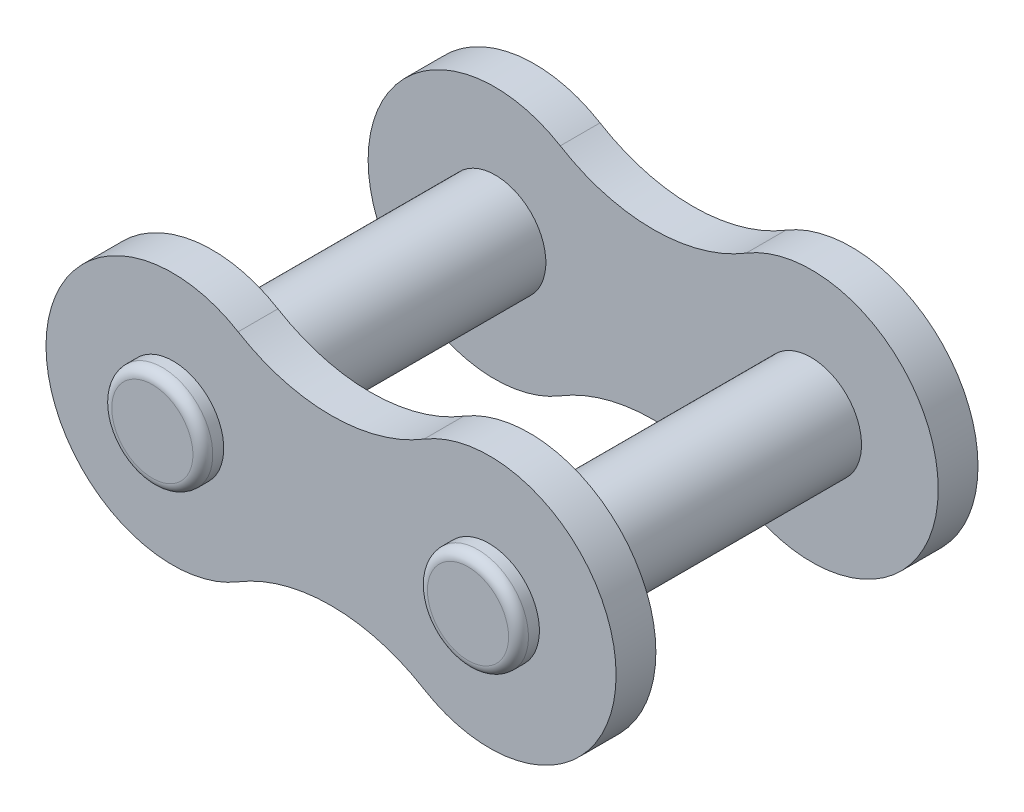
ISO-10303-21;
HEADER;
FILE_DESCRIPTION(('STEP AP214'),'2;1');
FILE_NAME('part.step','',(''),(''),'','','');
FILE_SCHEMA(('AUTOMOTIVE_DESIGN { 1 0 10303 214 1 1 1 1 }'));
ENDSEC;
DATA;
#1=APPLICATION_CONTEXT('core data for automotive mechanical design processes');
#2=APPLICATION_PROTOCOL_DEFINITION('international standard','automotive_design',2000,#1);
#3=PRODUCT_CONTEXT('',#1,'mechanical');
#4=PRODUCT('Part','Part','',(#3));
#5=PRODUCT_RELATED_PRODUCT_CATEGORY('part','',(#4));
#6=PRODUCT_DEFINITION_FORMATION('','',#4);
#7=PRODUCT_DEFINITION_CONTEXT('part definition',#1,'design');
#8=PRODUCT_DEFINITION('design','',#6,#7);
#9=PRODUCT_DEFINITION_SHAPE('','',#8);
#10=(LENGTH_UNIT() NAMED_UNIT(*) SI_UNIT(.MILLI.,.METRE.));
#11=(NAMED_UNIT(*) PLANE_ANGLE_UNIT() SI_UNIT($,.RADIAN.));
#12=(NAMED_UNIT(*) SI_UNIT($,.STERADIAN.) SOLID_ANGLE_UNIT());
#13=UNCERTAINTY_MEASURE_WITH_UNIT(LENGTH_MEASURE(1.E-05),#10,'distance_accuracy_value','');
#14=(GEOMETRIC_REPRESENTATION_CONTEXT(3) GLOBAL_UNCERTAINTY_ASSIGNED_CONTEXT((#13)) GLOBAL_UNIT_ASSIGNED_CONTEXT((#10,
#11,#12)) REPRESENTATION_CONTEXT('',''));
#15=CARTESIAN_POINT('',(0.,0.,0.));
#16=DIRECTION('',(0.,0.,1.));
#17=DIRECTION('',(1.,0.,0.));
#18=AXIS2_PLACEMENT_3D('',#15,#16,#17);
#19=CARTESIAN_POINT('',(-7.9375,0.,10.15));
#20=DIRECTION('',(0.,0.,1.));
#21=DIRECTION('',(1.,0.,0.));
#22=AXIS2_PLACEMENT_3D('',#19,#20,#21);
#23=PLANE('',#22);
#24=CARTESIAN_POINT('',(-7.9375,0.,10.1499999999998));
#25=DIRECTION('',(0.,0.,-1.));
#26=DIRECTION('',(-1.,0.,0.));
#27=AXIS2_PLACEMENT_3D('',#24,#25,#26);
#28=CIRCLE('',#27,2.039999612303);
#29=CARTESIAN_POINT('',(-9.977499612303,0.,10.1499999999998));
#30=VERTEX_POINT('',#29);
#31=EDGE_CURVE('E148',#30,#30,#28,.T.);
#32=ORIENTED_EDGE('',*,*,#31,.F.);
#33=EDGE_LOOP('',(#32));
#34=FACE_BOUND('',#33,.T.);
#35=ADVANCED_FACE('F17',(#34),#23,.T.);
#36=CARTESIAN_POINT('',(7.9375,0.,10.15));
#37=DIRECTION('',(0.,0.,1.));
#38=DIRECTION('',(1.,0.,0.));
#39=AXIS2_PLACEMENT_3D('',#36,#37,#38);
#40=PLANE('',#39);
#41=CARTESIAN_POINT('',(7.9375,0.,10.1499999999998));
#42=DIRECTION('',(0.,0.,-1.));
#43=DIRECTION('',(1.,0.,0.));
#44=AXIS2_PLACEMENT_3D('',#41,#42,#43);
#45=CIRCLE('',#44,2.039999612303);
#46=CARTESIAN_POINT('',(9.977499612303,0.,10.1499999999998));
#47=VERTEX_POINT('',#46);
#48=EDGE_CURVE('E114',#47,#47,#45,.T.);
#49=ORIENTED_EDGE('',*,*,#48,.F.);
#50=EDGE_LOOP('',(#49));
#51=FACE_BOUND('',#50,.T.);
#52=ADVANCED_FACE('F233',(#51),#40,.T.);
#53=CARTESIAN_POINT('',(-7.9375,0.,9.65));
#54=DIRECTION('',(0.,0.,1.));
#55=DIRECTION('',(0.998168099586961,-0.0605016112756876,0.));
#56=AXIS2_PLACEMENT_3D('',#53,#54,#55);
#57=TOROIDAL_SURFACE('',#56,2.04,0.5);
#58=CARTESIAN_POINT('',(-7.9375,0.,9.65));
#59=DIRECTION('',(0.,0.,-1.));
#60=DIRECTION('',(-1.,0.,0.));
#61=AXIS2_PLACEMENT_3D('',#58,#59,#60);
#62=CIRCLE('',#61,2.54);
#63=CARTESIAN_POINT('',(-10.4775,0.,9.65));
#64=VERTEX_POINT('',#63);
#65=EDGE_CURVE('E110',#64,#64,#62,.T.);
#66=ORIENTED_EDGE('',*,*,#65,.F.);
#67=EDGE_LOOP('',(#66));
#68=FACE_BOUND('',#67,.T.);
#69=ORIENTED_EDGE('',*,*,#31,.T.);
#70=EDGE_LOOP('',(#69));
#71=FACE_BOUND('',#70,.T.);
#72=ADVANCED_FACE('F128',(#68,#71),#57,.T.);
#73=CARTESIAN_POINT('',(7.9375,0.,9.65));
#74=DIRECTION('',(0.,0.,1.));
#75=DIRECTION('',(-0.998168099586961,0.0605016112756876,0.));
#76=AXIS2_PLACEMENT_3D('',#73,#74,#75);
#77=TOROIDAL_SURFACE('',#76,2.04,0.5);
#78=CARTESIAN_POINT('',(7.9375,0.,9.65));
#79=DIRECTION('',(0.,0.,-1.));
#80=DIRECTION('',(-1.,0.,0.));
#81=AXIS2_PLACEMENT_3D('',#78,#79,#80);
#82=CIRCLE('',#81,2.54);
#83=CARTESIAN_POINT('',(5.3975,0.,9.65));
#84=VERTEX_POINT('',#83);
#85=EDGE_CURVE('E113',#84,#84,#82,.T.);
#86=ORIENTED_EDGE('',*,*,#85,.F.);
#87=EDGE_LOOP('',(#86));
#88=FACE_BOUND('',#87,.T.);
#89=ORIENTED_EDGE('',*,*,#48,.T.);
#90=EDGE_LOOP('',(#89));
#91=FACE_BOUND('',#90,.T.);
#92=ADVANCED_FACE('F122',(#88,#91),#77,.T.);
#93=CARTESIAN_POINT('',(-7.9375,0.,-9.65));
#94=DIRECTION('',(0.,0.,-1.));
#95=DIRECTION('',(-1.,0.,0.));
#96=AXIS2_PLACEMENT_3D('',#93,#94,#95);
#97=CYLINDRICAL_SURFACE('',#96,2.54);
#98=CARTESIAN_POINT('',(-7.9375,0.,9.1));
#99=DIRECTION('',(0.,0.,-1.));
#100=DIRECTION('',(-1.,0.,0.));
#101=AXIS2_PLACEMENT_3D('',#98,#99,#100);
#102=CIRCLE('',#101,2.54);
#103=CARTESIAN_POINT('',(-10.4775,0.,9.1));
#104=VERTEX_POINT('',#103);
#105=EDGE_CURVE('E21',#104,#104,#102,.T.);
#106=ORIENTED_EDGE('',*,*,#105,.F.);
#107=EDGE_LOOP('',(#106));
#108=FACE_BOUND('',#107,.T.);
#109=ORIENTED_EDGE('',*,*,#65,.T.);
#110=EDGE_LOOP('',(#109));
#111=FACE_BOUND('',#110,.T.);
#112=ADVANCED_FACE('F127',(#108,#111),#97,.T.);
#113=CARTESIAN_POINT('',(7.9375,0.,-9.65));
#114=DIRECTION('',(0.,0.,-1.));
#115=DIRECTION('',(-1.,0.,0.));
#116=AXIS2_PLACEMENT_3D('',#113,#114,#115);
#117=CYLINDRICAL_SURFACE('',#116,2.54);
#118=ORIENTED_EDGE('',*,*,#85,.T.);
#119=EDGE_LOOP('',(#118));
#120=FACE_BOUND('',#119,.T.);
#121=CARTESIAN_POINT('',(7.9375,0.,9.1));
#122=DIRECTION('',(0.,0.,-1.));
#123=DIRECTION('',(-1.,0.,0.));
#124=AXIS2_PLACEMENT_3D('',#121,#122,#123);
#125=CIRCLE('',#124,2.54);
#126=CARTESIAN_POINT('',(5.3975,0.,9.1));
#127=VERTEX_POINT('',#126);
#128=EDGE_CURVE('E100',#127,#127,#125,.T.);
#129=ORIENTED_EDGE('',*,*,#128,.F.);
#130=EDGE_LOOP('',(#129));
#131=FACE_BOUND('',#130,.T.);
#132=ADVANCED_FACE('F229',(#120,#131),#117,.T.);
#133=CARTESIAN_POINT('',(0.,0.,9.1));
#134=DIRECTION('',(0.,0.,1.));
#135=DIRECTION('',(1.,0.,0.));
#136=AXIS2_PLACEMENT_3D('',#133,#134,#135);
#137=PLANE('',#136);
#138=ORIENTED_EDGE('',*,*,#128,.T.);
#139=EDGE_LOOP('',(#138));
#140=FACE_BOUND('',#139,.T.);
#141=ORIENTED_EDGE('',*,*,#105,.T.);
#142=EDGE_LOOP('',(#141));
#143=FACE_BOUND('',#142,.T.);
#144=CARTESIAN_POINT('',(0.,13.16185955056,9.1));
#145=DIRECTION('',(0.,0.,1.));
#146=DIRECTION('',(1.,0.,0.));
#147=AXIS2_PLACEMENT_3D('',#144,#145,#146);
#148=CIRCLE('',#147,9.02185955056);
#149=CARTESIAN_POINT('',(4.67309267246473,5.44459613503587,9.1));
#150=VERTEX_POINT('',#149);
#151=CARTESIAN_POINT('',(-4.6730926724648,5.44459613503576,9.1));
#152=VERTEX_POINT('',#151);
#153=EDGE_CURVE('E96',#150,#152,#148,.F.);
#154=ORIENTED_EDGE('',*,*,#153,.T.);
#155=CARTESIAN_POINT('',(-7.97,0.,9.1));
#156=DIRECTION('',(0.,0.,-1.));
#157=DIRECTION('',(-1.,0.,0.));
#158=AXIS2_PLACEMENT_3D('',#155,#156,#157);
#159=CIRCLE('',#158,6.365);
#160=CARTESIAN_POINT('',(-4.67309267246473,-5.44459613503587,9.1));
#161=VERTEX_POINT('',#160);
#162=EDGE_CURVE('E91',#161,#152,#159,.T.);
#163=ORIENTED_EDGE('',*,*,#162,.F.);
#164=CARTESIAN_POINT('',(0.,-13.16185955056,9.1));
#165=DIRECTION('',(0.,0.,1.));
#166=DIRECTION('',(1.,0.,0.));
#167=AXIS2_PLACEMENT_3D('',#164,#165,#166);
#168=CIRCLE('',#167,9.02185955056);
#169=CARTESIAN_POINT('',(4.6730926724648,-5.44459613503576,9.1));
#170=VERTEX_POINT('',#169);
#171=EDGE_CURVE('E80',#161,#170,#168,.F.);
#172=ORIENTED_EDGE('',*,*,#171,.T.);
#173=CARTESIAN_POINT('',(7.97,0.,9.1));
#174=DIRECTION('',(0.,0.,-1.));
#175=DIRECTION('',(-1.,0.,0.));
#176=AXIS2_PLACEMENT_3D('',#173,#174,#175);
#177=CIRCLE('',#176,6.365);
#178=EDGE_CURVE('E106',#150,#170,#177,.T.);
#179=ORIENTED_EDGE('',*,*,#178,.F.);
#180=EDGE_LOOP('',(#154,#163,#172,#179));
#181=FACE_BOUND('',#180,.T.);
#182=ADVANCED_FACE('F95',(#140,#143,#181),#137,.T.);
#183=CARTESIAN_POINT('',(-7.97,0.,7.1));
#184=DIRECTION('',(0.,0.,-1.));
#185=DIRECTION('',(-1.,0.,0.));
#186=AXIS2_PLACEMENT_3D('',#183,#184,#185);
#187=CYLINDRICAL_SURFACE('',#186,6.365);
#188=DIRECTION('',(0.,0.,1.));
#189=VECTOR('',#188,1.);
#190=CARTESIAN_POINT('',(-4.67309267246499,-5.44459613503603,9.1));
#191=LINE('',#190,#189);
#192=CARTESIAN_POINT('',(-4.67309267246473,-5.44459613503587,7.1));
#193=VERTEX_POINT('',#192);
#194=EDGE_CURVE('E85',#193,#161,#191,.T.);
#195=ORIENTED_EDGE('',*,*,#194,.T.);
#196=ORIENTED_EDGE('',*,*,#162,.T.);
#197=DIRECTION('',(0.,0.,1.));
#198=VECTOR('',#197,1.);
#199=CARTESIAN_POINT('',(-4.67309267246498,5.44459613503602,9.1));
#200=LINE('',#199,#198);
#201=CARTESIAN_POINT('',(-4.6730926724648,5.44459613503576,7.1));
#202=VERTEX_POINT('',#201);
#203=EDGE_CURVE('E219',#152,#202,#200,.F.);
#204=ORIENTED_EDGE('',*,*,#203,.T.);
#205=CARTESIAN_POINT('',(-7.97,0.,7.1));
#206=DIRECTION('',(0.,0.,-1.));
#207=DIRECTION('',(-1.,0.,0.));
#208=AXIS2_PLACEMENT_3D('',#205,#206,#207);
#209=CIRCLE('',#208,6.365);
#210=EDGE_CURVE('E104',#202,#193,#209,.F.);
#211=ORIENTED_EDGE('',*,*,#210,.T.);
#212=EDGE_LOOP('',(#195,#196,#204,#211));
#213=FACE_BOUND('',#212,.T.);
#214=ADVANCED_FACE('F103',(#213),#187,.T.);
#215=CARTESIAN_POINT('',(0.,-13.16185955056,9.1));
#216=DIRECTION('',(0.,0.,1.));
#217=DIRECTION('',(1.,0.,0.));
#218=AXIS2_PLACEMENT_3D('',#215,#216,#217);
#219=CYLINDRICAL_SURFACE('',#218,9.02185955056);
#220=CARTESIAN_POINT('',(0.,-13.16185955056,7.1));
#221=DIRECTION('',(0.,0.,1.));
#222=DIRECTION('',(1.,0.,0.));
#223=AXIS2_PLACEMENT_3D('',#220,#221,#222);
#224=CIRCLE('',#223,9.02185955056);
#225=CARTESIAN_POINT('',(4.67309267246487,-5.44459613503565,7.1));
#226=VERTEX_POINT('',#225);
#227=EDGE_CURVE('E214',#193,#226,#224,.F.);
#228=ORIENTED_EDGE('',*,*,#227,.T.);
#229=DIRECTION('',(0.,0.,-1.));
#230=VECTOR('',#229,1.);
#231=CARTESIAN_POINT('',(4.67309267246512,-5.4445961350358,7.1));
#232=LINE('',#231,#230);
#233=EDGE_CURVE('E87',#170,#226,#232,.T.);
#234=ORIENTED_EDGE('',*,*,#233,.F.);
#235=ORIENTED_EDGE('',*,*,#171,.F.);
#236=ORIENTED_EDGE('',*,*,#194,.F.);
#237=EDGE_LOOP('',(#228,#234,#235,#236));
#238=FACE_BOUND('',#237,.T.);
#239=ADVANCED_FACE('F83',(#238),#219,.F.);
#240=CARTESIAN_POINT('',(7.97,0.,7.1));
#241=DIRECTION('',(0.,0.,-1.));
#242=DIRECTION('',(-1.,0.,0.));
#243=AXIS2_PLACEMENT_3D('',#240,#241,#242);
#244=CYLINDRICAL_SURFACE('',#243,6.365);
#245=DIRECTION('',(0.,0.,1.));
#246=VECTOR('',#245,1.);
#247=CARTESIAN_POINT('',(4.67309267246498,5.44459613503602,9.1));
#248=LINE('',#247,#246);
#249=CARTESIAN_POINT('',(4.67309267246473,5.44459613503587,7.1));
#250=VERTEX_POINT('',#249);
#251=EDGE_CURVE('E217',#250,#150,#248,.T.);
#252=ORIENTED_EDGE('',*,*,#251,.T.);
#253=ORIENTED_EDGE('',*,*,#178,.T.);
#254=ORIENTED_EDGE('',*,*,#233,.T.);
#255=CARTESIAN_POINT('',(7.97,0.,7.1));
#256=DIRECTION('',(0.,0.,-1.));
#257=DIRECTION('',(-1.,0.,0.));
#258=AXIS2_PLACEMENT_3D('',#255,#256,#257);
#259=CIRCLE('',#258,6.365);
#260=EDGE_CURVE('E211',#226,#250,#259,.F.);
#261=ORIENTED_EDGE('',*,*,#260,.T.);
#262=EDGE_LOOP('',(#252,#253,#254,#261));
#263=FACE_BOUND('',#262,.T.);
#264=ADVANCED_FACE('F339',(#263),#244,.T.);
#265=CARTESIAN_POINT('',(0.,13.16185955056,9.1));
#266=DIRECTION('',(0.,0.,1.));
#267=DIRECTION('',(1.,0.,0.));
#268=AXIS2_PLACEMENT_3D('',#265,#266,#267);
#269=CYLINDRICAL_SURFACE('',#268,9.02185955056);
#270=CARTESIAN_POINT('',(0.,13.16185955056,7.1));
#271=DIRECTION('',(0.,0.,1.));
#272=DIRECTION('',(1.,0.,0.));
#273=AXIS2_PLACEMENT_3D('',#270,#271,#272);
#274=CIRCLE('',#273,9.02185955056);
#275=EDGE_CURVE('E208',#250,#202,#274,.F.);
#276=ORIENTED_EDGE('',*,*,#275,.T.);
#277=ORIENTED_EDGE('',*,*,#203,.F.);
#278=ORIENTED_EDGE('',*,*,#153,.F.);
#279=ORIENTED_EDGE('',*,*,#251,.F.);
#280=EDGE_LOOP('',(#276,#277,#278,#279));
#281=FACE_BOUND('',#280,.T.);
#282=ADVANCED_FACE('F343',(#281),#269,.F.);
#283=CARTESIAN_POINT('',(0.,0.,7.1));
#284=DIRECTION('',(0.,0.,1.));
#285=DIRECTION('',(1.,0.,0.));
#286=AXIS2_PLACEMENT_3D('',#283,#284,#285);
#287=PLANE('',#286);
#288=CARTESIAN_POINT('',(7.9375,0.,7.1));
#289=DIRECTION('',(0.,0.,-1.));
#290=DIRECTION('',(-1.,0.,0.));
#291=AXIS2_PLACEMENT_3D('',#288,#289,#290);
#292=CIRCLE('',#291,2.54);
#293=CARTESIAN_POINT('',(5.3975,0.,7.1));
#294=VERTEX_POINT('',#293);
#295=EDGE_CURVE('E202',#294,#294,#292,.T.);
#296=ORIENTED_EDGE('',*,*,#295,.F.);
#297=EDGE_LOOP('',(#296));
#298=FACE_BOUND('',#297,.T.);
#299=CARTESIAN_POINT('',(-7.9375,0.,7.1));
#300=DIRECTION('',(0.,0.,-1.));
#301=DIRECTION('',(-1.,0.,0.));
#302=AXIS2_PLACEMENT_3D('',#299,#300,#301);
#303=CIRCLE('',#302,2.54);
#304=CARTESIAN_POINT('',(-10.4775,0.,7.1));
#305=VERTEX_POINT('',#304);
#306=EDGE_CURVE('E205',#305,#305,#303,.T.);
#307=ORIENTED_EDGE('',*,*,#306,.F.);
#308=EDGE_LOOP('',(#307));
#309=FACE_BOUND('',#308,.T.);
#310=ORIENTED_EDGE('',*,*,#260,.F.);
#311=ORIENTED_EDGE('',*,*,#227,.F.);
#312=ORIENTED_EDGE('',*,*,#210,.F.);
#313=ORIENTED_EDGE('',*,*,#275,.F.);
#314=EDGE_LOOP('',(#310,#311,#312,#313));
#315=FACE_BOUND('',#314,.T.);
#316=ADVANCED_FACE('F345',(#298,#309,#315),#287,.F.);
#317=CARTESIAN_POINT('',(-7.9375,0.,-9.65));
#318=DIRECTION('',(0.,0.,-1.));
#319=DIRECTION('',(-1.,0.,0.));
#320=AXIS2_PLACEMENT_3D('',#317,#318,#319);
#321=CYLINDRICAL_SURFACE('',#320,2.54);
#322=ORIENTED_EDGE('',*,*,#306,.T.);
#323=EDGE_LOOP('',(#322));
#324=FACE_BOUND('',#323,.T.);
#325=CARTESIAN_POINT('',(-7.9375,0.,-7.1));
#326=DIRECTION('',(0.,0.,-1.));
#327=DIRECTION('',(-1.,0.,0.));
#328=AXIS2_PLACEMENT_3D('',#325,#326,#327);
#329=CIRCLE('',#328,2.54);
#330=CARTESIAN_POINT('',(-10.4775,0.,-7.1));
#331=VERTEX_POINT('',#330);
#332=EDGE_CURVE('E199',#331,#331,#329,.T.);
#333=ORIENTED_EDGE('',*,*,#332,.F.);
#334=EDGE_LOOP('',(#333));
#335=FACE_BOUND('',#334,.T.);
#336=ADVANCED_FACE('F347',(#324,#335),#321,.T.);
#337=CARTESIAN_POINT('',(7.9375,0.,-9.65));
#338=DIRECTION('',(0.,0.,-1.));
#339=DIRECTION('',(-1.,0.,0.));
#340=AXIS2_PLACEMENT_3D('',#337,#338,#339);
#341=CYLINDRICAL_SURFACE('',#340,2.54);
#342=ORIENTED_EDGE('',*,*,#295,.T.);
#343=EDGE_LOOP('',(#342));
#344=FACE_BOUND('',#343,.T.);
#345=CARTESIAN_POINT('',(7.9375,0.,-7.1));
#346=DIRECTION('',(0.,0.,-1.));
#347=DIRECTION('',(-1.,0.,0.));
#348=AXIS2_PLACEMENT_3D('',#345,#346,#347);
#349=CIRCLE('',#348,2.54);
#350=CARTESIAN_POINT('',(5.3975,0.,-7.1));
#351=VERTEX_POINT('',#350);
#352=EDGE_CURVE('E195',#351,#351,#349,.T.);
#353=ORIENTED_EDGE('',*,*,#352,.F.);
#354=EDGE_LOOP('',(#353));
#355=FACE_BOUND('',#354,.T.);
#356=ADVANCED_FACE('F312',(#344,#355),#341,.T.);
#357=CARTESIAN_POINT('',(-7.9375,0.,-10.15));
#358=DIRECTION('',(0.,0.,1.));
#359=DIRECTION('',(1.,0.,0.));
#360=AXIS2_PLACEMENT_3D('',#357,#358,#359);
#361=PLANE('',#360);
#362=CARTESIAN_POINT('',(-7.9375,0.,-10.1499999999998));
#363=DIRECTION('',(0.,0.,1.));
#364=DIRECTION('',(1.,0.,0.));
#365=AXIS2_PLACEMENT_3D('',#362,#363,#364);
#366=CIRCLE('',#365,2.039999558838);
#367=CARTESIAN_POINT('',(-5.897500441162,0.,-10.1499999999998));
#368=VERTEX_POINT('',#367);
#369=EDGE_CURVE('E198',#368,#368,#366,.T.);
#370=ORIENTED_EDGE('',*,*,#369,.F.);
#371=EDGE_LOOP('',(#370));
#372=FACE_BOUND('',#371,.T.);
#373=ADVANCED_FACE('F308',(#372),#361,.F.);
#374=CARTESIAN_POINT('',(7.9375,0.,-10.15));
#375=DIRECTION('',(0.,0.,1.));
#376=DIRECTION('',(1.,0.,0.));
#377=AXIS2_PLACEMENT_3D('',#374,#375,#376);
#378=PLANE('',#377);
#379=CARTESIAN_POINT('',(7.9375,0.,-10.1499999999998));
#380=DIRECTION('',(0.,0.,1.));
#381=DIRECTION('',(-1.,0.,0.));
#382=AXIS2_PLACEMENT_3D('',#379,#380,#381);
#383=CIRCLE('',#382,2.039999558838);
#384=CARTESIAN_POINT('',(5.897500441162,0.,-10.1499999999998));
#385=VERTEX_POINT('',#384);
#386=EDGE_CURVE('E194',#385,#385,#383,.T.);
#387=ORIENTED_EDGE('',*,*,#386,.F.);
#388=EDGE_LOOP('',(#387));
#389=FACE_BOUND('',#388,.T.);
#390=ADVANCED_FACE('F298',(#389),#378,.F.);
#391=CARTESIAN_POINT('',(0.,0.,-7.1));
#392=DIRECTION('',(0.,0.,1.));
#393=DIRECTION('',(1.,0.,0.));
#394=AXIS2_PLACEMENT_3D('',#391,#392,#393);
#395=PLANE('',#394);
#396=ORIENTED_EDGE('',*,*,#352,.T.);
#397=EDGE_LOOP('',(#396));
#398=FACE_BOUND('',#397,.T.);
#399=ORIENTED_EDGE('',*,*,#332,.T.);
#400=EDGE_LOOP('',(#399));
#401=FACE_BOUND('',#400,.T.);
#402=CARTESIAN_POINT('',(0.,13.16185955056,-7.1));
#403=DIRECTION('',(0.,0.,-1.));
#404=DIRECTION('',(-1.,0.,0.));
#405=AXIS2_PLACEMENT_3D('',#402,#403,#404);
#406=CIRCLE('',#405,9.02185955056);
#407=CARTESIAN_POINT('',(4.6730926724648,5.44459613503576,-7.1));
#408=VERTEX_POINT('',#407);
#409=CARTESIAN_POINT('',(-4.6730926724648,5.44459613503576,-7.1));
#410=VERTEX_POINT('',#409);
#411=EDGE_CURVE('E181',#408,#410,#406,.T.);
#412=ORIENTED_EDGE('',*,*,#411,.T.);
#413=CARTESIAN_POINT('',(-7.97,0.,-7.1));
#414=DIRECTION('',(0.,0.,1.));
#415=DIRECTION('',(1.,0.,0.));
#416=AXIS2_PLACEMENT_3D('',#413,#414,#415);
#417=CIRCLE('',#416,6.365);
#418=CARTESIAN_POINT('',(-4.6730926724648,-5.44459613503576,-7.1));
#419=VERTEX_POINT('',#418);
#420=EDGE_CURVE('E192',#419,#410,#417,.F.);
#421=ORIENTED_EDGE('',*,*,#420,.F.);
#422=CARTESIAN_POINT('',(0.,-13.16185955056,-7.1));
#423=DIRECTION('',(0.,0.,-1.));
#424=DIRECTION('',(-1.,0.,0.));
#425=AXIS2_PLACEMENT_3D('',#422,#423,#424);
#426=CIRCLE('',#425,9.02185955056);
#427=CARTESIAN_POINT('',(4.67309267246486,-5.44459613503565,-7.1));
#428=VERTEX_POINT('',#427);
#429=EDGE_CURVE('E188',#419,#428,#426,.T.);
#430=ORIENTED_EDGE('',*,*,#429,.T.);
#431=CARTESIAN_POINT('',(7.97,0.,-7.1));
#432=DIRECTION('',(0.,0.,1.));
#433=DIRECTION('',(1.,0.,0.));
#434=AXIS2_PLACEMENT_3D('',#431,#432,#433);
#435=CIRCLE('',#434,6.365);
#436=EDGE_CURVE('E185',#408,#428,#435,.F.);
#437=ORIENTED_EDGE('',*,*,#436,.F.);
#438=EDGE_LOOP('',(#412,#421,#430,#437));
#439=FACE_BOUND('',#438,.T.);
#440=ADVANCED_FACE('F307',(#398,#401,#439),#395,.T.);
#441=CARTESIAN_POINT('',(-7.9375,0.,-9.65));
#442=DIRECTION('',(0.,0.,1.));
#443=DIRECTION('',(-0.996304413903798,-0.0858924608787599,0.));
#444=AXIS2_PLACEMENT_3D('',#441,#442,#443);
#445=TOROIDAL_SURFACE('',#444,2.04,0.5);
#446=CARTESIAN_POINT('',(-7.9375,0.,-9.65));
#447=DIRECTION('',(0.,0.,-1.));
#448=DIRECTION('',(-1.,0.,0.));
#449=AXIS2_PLACEMENT_3D('',#446,#447,#448);
#450=CIRCLE('',#449,2.54);
#451=CARTESIAN_POINT('',(-10.4775,0.,-9.65));
#452=VERTEX_POINT('',#451);
#453=EDGE_CURVE('E286',#452,#452,#450,.F.);
#454=ORIENTED_EDGE('',*,*,#453,.F.);
#455=EDGE_LOOP('',(#454));
#456=FACE_BOUND('',#455,.T.);
#457=ORIENTED_EDGE('',*,*,#369,.T.);
#458=EDGE_LOOP('',(#457));
#459=FACE_BOUND('',#458,.T.);
#460=ADVANCED_FACE('F276',(#456,#459),#445,.T.);
#461=CARTESIAN_POINT('',(7.9375,0.,-9.65));
#462=DIRECTION('',(0.,0.,1.));
#463=DIRECTION('',(0.996304413903798,0.0858924608787599,0.));
#464=AXIS2_PLACEMENT_3D('',#461,#462,#463);
#465=TOROIDAL_SURFACE('',#464,2.04,0.5);
#466=CARTESIAN_POINT('',(7.9375,0.,-9.65));
#467=DIRECTION('',(0.,0.,-1.));
#468=DIRECTION('',(-1.,0.,0.));
#469=AXIS2_PLACEMENT_3D('',#466,#467,#468);
#470=CIRCLE('',#469,2.54);
#471=CARTESIAN_POINT('',(5.3975,0.,-9.65));
#472=VERTEX_POINT('',#471);
#473=EDGE_CURVE('E180',#472,#472,#470,.F.);
#474=ORIENTED_EDGE('',*,*,#473,.F.);
#475=EDGE_LOOP('',(#474));
#476=FACE_BOUND('',#475,.T.);
#477=ORIENTED_EDGE('',*,*,#386,.T.);
#478=EDGE_LOOP('',(#477));
#479=FACE_BOUND('',#478,.T.);
#480=ADVANCED_FACE('F270',(#476,#479),#465,.T.);
#481=CARTESIAN_POINT('',(-7.97,0.,-7.1));
#482=DIRECTION('',(0.,0.,1.));
#483=DIRECTION('',(1.,0.,0.));
#484=AXIS2_PLACEMENT_3D('',#481,#482,#483);
#485=CYLINDRICAL_SURFACE('',#484,6.365);
#486=DIRECTION('',(0.,0.,-1.));
#487=VECTOR('',#486,1.);
#488=CARTESIAN_POINT('',(-4.67309267246498,5.44459613503602,-9.1));
#489=LINE('',#488,#487);
#490=CARTESIAN_POINT('',(-4.6730926724648,5.44459613503576,-9.1));
#491=VERTEX_POINT('',#490);
#492=EDGE_CURVE('E184',#410,#491,#489,.T.);
#493=ORIENTED_EDGE('',*,*,#492,.T.);
#494=CARTESIAN_POINT('',(-7.97,0.,-9.1));
#495=DIRECTION('',(0.,0.,1.));
#496=DIRECTION('',(1.,0.,0.));
#497=AXIS2_PLACEMENT_3D('',#494,#495,#496);
#498=CIRCLE('',#497,6.365);
#499=CARTESIAN_POINT('',(-4.67309267246473,-5.44459613503587,-9.1));
#500=VERTEX_POINT('',#499);
#501=EDGE_CURVE('E177',#491,#500,#498,.T.);
#502=ORIENTED_EDGE('',*,*,#501,.T.);
#503=DIRECTION('',(0.,0.,-1.));
#504=VECTOR('',#503,1.);
#505=CARTESIAN_POINT('',(-4.67309267246498,-5.44459613503602,-9.1));
#506=LINE('',#505,#504);
#507=EDGE_CURVE('E191',#500,#419,#506,.F.);
#508=ORIENTED_EDGE('',*,*,#507,.T.);
#509=ORIENTED_EDGE('',*,*,#420,.T.);
#510=EDGE_LOOP('',(#493,#502,#508,#509));
#511=FACE_BOUND('',#510,.T.);
#512=ADVANCED_FACE('F266',(#511),#485,.T.);
#513=CARTESIAN_POINT('',(0.,-13.16185955056,-9.1));
#514=DIRECTION('',(0.,0.,-1.));
#515=DIRECTION('',(-1.,0.,0.));
#516=AXIS2_PLACEMENT_3D('',#513,#514,#515);
#517=CYLINDRICAL_SURFACE('',#516,9.02185955056);
#518=ORIENTED_EDGE('',*,*,#429,.F.);
#519=ORIENTED_EDGE('',*,*,#507,.F.);
#520=CARTESIAN_POINT('',(0.,-13.16185955056,-9.1));
#521=DIRECTION('',(0.,0.,-1.));
#522=DIRECTION('',(-1.,0.,0.));
#523=AXIS2_PLACEMENT_3D('',#520,#521,#522);
#524=CIRCLE('',#523,9.02185955056);
#525=CARTESIAN_POINT('',(4.67309267246486,-5.44459613503565,-9.1));
#526=VERTEX_POINT('',#525);
#527=EDGE_CURVE('E174',#500,#526,#524,.T.);
#528=ORIENTED_EDGE('',*,*,#527,.T.);
#529=DIRECTION('',(0.,0.,1.));
#530=VECTOR('',#529,1.);
#531=CARTESIAN_POINT('',(4.67309267246512,-5.4445961350358,-7.1));
#532=LINE('',#531,#530);
#533=EDGE_CURVE('E187',#428,#526,#532,.F.);
#534=ORIENTED_EDGE('',*,*,#533,.F.);
#535=EDGE_LOOP('',(#518,#519,#528,#534));
#536=FACE_BOUND('',#535,.T.);
#537=ADVANCED_FACE('F262',(#536),#517,.F.);
#538=CARTESIAN_POINT('',(7.97,0.,-7.1));
#539=DIRECTION('',(0.,0.,1.));
#540=DIRECTION('',(1.,0.,0.));
#541=AXIS2_PLACEMENT_3D('',#538,#539,#540);
#542=CYLINDRICAL_SURFACE('',#541,6.365);
#543=ORIENTED_EDGE('',*,*,#533,.T.);
#544=CARTESIAN_POINT('',(7.97,0.,-9.1));
#545=DIRECTION('',(0.,0.,1.));
#546=DIRECTION('',(1.,0.,0.));
#547=AXIS2_PLACEMENT_3D('',#544,#545,#546);
#548=CIRCLE('',#547,6.365);
#549=CARTESIAN_POINT('',(4.67309267246473,5.44459613503587,-9.1));
#550=VERTEX_POINT('',#549);
#551=EDGE_CURVE('E171',#526,#550,#548,.T.);
#552=ORIENTED_EDGE('',*,*,#551,.T.);
#553=DIRECTION('',(0.,0.,-1.));
#554=VECTOR('',#553,1.);
#555=CARTESIAN_POINT('',(4.67309267246498,5.44459613503602,-9.1));
#556=LINE('',#555,#554);
#557=EDGE_CURVE('E36',#550,#408,#556,.F.);
#558=ORIENTED_EDGE('',*,*,#557,.T.);
#559=ORIENTED_EDGE('',*,*,#436,.T.);
#560=EDGE_LOOP('',(#543,#552,#558,#559));
#561=FACE_BOUND('',#560,.T.);
#562=ADVANCED_FACE('F259',(#561),#542,.T.);
#563=CARTESIAN_POINT('',(0.,13.16185955056,-9.1));
#564=DIRECTION('',(0.,0.,-1.));
#565=DIRECTION('',(-1.,0.,0.));
#566=AXIS2_PLACEMENT_3D('',#563,#564,#565);
#567=CYLINDRICAL_SURFACE('',#566,9.02185955056);
#568=ORIENTED_EDGE('',*,*,#411,.F.);
#569=ORIENTED_EDGE('',*,*,#557,.F.);
#570=CARTESIAN_POINT('',(0.,13.16185955056,-9.1));
#571=DIRECTION('',(0.,0.,-1.));
#572=DIRECTION('',(-1.,0.,0.));
#573=AXIS2_PLACEMENT_3D('',#570,#571,#572);
#574=CIRCLE('',#573,9.02185955056);
#575=EDGE_CURVE('E169',#550,#491,#574,.T.);
#576=ORIENTED_EDGE('',*,*,#575,.T.);
#577=ORIENTED_EDGE('',*,*,#492,.F.);
#578=EDGE_LOOP('',(#568,#569,#576,#577));
#579=FACE_BOUND('',#578,.T.);
#580=ADVANCED_FACE('F255',(#579),#567,.F.);
#581=CARTESIAN_POINT('',(-7.9375,0.,-9.65));
#582=DIRECTION('',(0.,0.,-1.));
#583=DIRECTION('',(-1.,0.,0.));
#584=AXIS2_PLACEMENT_3D('',#581,#582,#583);
#585=CYLINDRICAL_SURFACE('',#584,2.54);
#586=ORIENTED_EDGE('',*,*,#453,.T.);
#587=EDGE_LOOP('',(#586));
#588=FACE_BOUND('',#587,.T.);
#589=CARTESIAN_POINT('',(-7.9375,0.,-9.1));
#590=DIRECTION('',(0.,0.,-1.));
#591=DIRECTION('',(-1.,0.,0.));
#592=AXIS2_PLACEMENT_3D('',#589,#590,#591);
#593=CIRCLE('',#592,2.54);
#594=CARTESIAN_POINT('',(-10.4775,0.,-9.1));
#595=VERTEX_POINT('',#594);
#596=EDGE_CURVE('E27',#595,#595,#593,.T.);
#597=ORIENTED_EDGE('',*,*,#596,.T.);
#598=EDGE_LOOP('',(#597));
#599=FACE_BOUND('',#598,.T.);
#600=ADVANCED_FACE('F247',(#588,#599),#585,.T.);
#601=CARTESIAN_POINT('',(7.9375,0.,-9.65));
#602=DIRECTION('',(0.,0.,-1.));
#603=DIRECTION('',(-1.,0.,0.));
#604=AXIS2_PLACEMENT_3D('',#601,#602,#603);
#605=CYLINDRICAL_SURFACE('',#604,2.54);
#606=ORIENTED_EDGE('',*,*,#473,.T.);
#607=EDGE_LOOP('',(#606));
#608=FACE_BOUND('',#607,.T.);
#609=CARTESIAN_POINT('',(7.9375,0.,-9.1));
#610=DIRECTION('',(0.,0.,-1.));
#611=DIRECTION('',(-1.,0.,0.));
#612=AXIS2_PLACEMENT_3D('',#609,#610,#611);
#613=CIRCLE('',#612,2.54);
#614=CARTESIAN_POINT('',(5.3975,0.,-9.1));
#615=VERTEX_POINT('',#614);
#616=EDGE_CURVE('E11',#615,#615,#613,.T.);
#617=ORIENTED_EDGE('',*,*,#616,.T.);
#618=EDGE_LOOP('',(#617));
#619=FACE_BOUND('',#618,.T.);
#620=ADVANCED_FACE('F241',(#608,#619),#605,.T.);
#621=CARTESIAN_POINT('',(0.,0.,-9.1));
#622=DIRECTION('',(0.,0.,1.));
#623=DIRECTION('',(1.,0.,0.));
#624=AXIS2_PLACEMENT_3D('',#621,#622,#623);
#625=PLANE('',#624);
#626=ORIENTED_EDGE('',*,*,#616,.F.);
#627=EDGE_LOOP('',(#626));
#628=FACE_BOUND('',#627,.T.);
#629=ORIENTED_EDGE('',*,*,#596,.F.);
#630=EDGE_LOOP('',(#629));
#631=FACE_BOUND('',#630,.T.);
#632=ORIENTED_EDGE('',*,*,#551,.F.);
#633=ORIENTED_EDGE('',*,*,#527,.F.);
#634=ORIENTED_EDGE('',*,*,#501,.F.);
#635=ORIENTED_EDGE('',*,*,#575,.F.);
#636=EDGE_LOOP('',(#632,#633,#634,#635));
#637=FACE_BOUND('',#636,.T.);
#638=ADVANCED_FACE('F239',(#628,#631,#637),#625,.F.);
#639=CLOSED_SHELL('',(#35,#52,#72,#92,#112,#132,#182,#214,#239,#264,#282,#316,#336,#356,#373,
#390,#440,#460,#480,#512,#537,#562,#580,#600,#620,#638));
#640=MANIFOLD_SOLID_BREP('B1',#639);
#641=ADVANCED_BREP_SHAPE_REPRESENTATION('',(#18,#640),#14);
#642=SHAPE_DEFINITION_REPRESENTATION(#9,#641);
ENDSEC;
END-ISO-10303-21;
